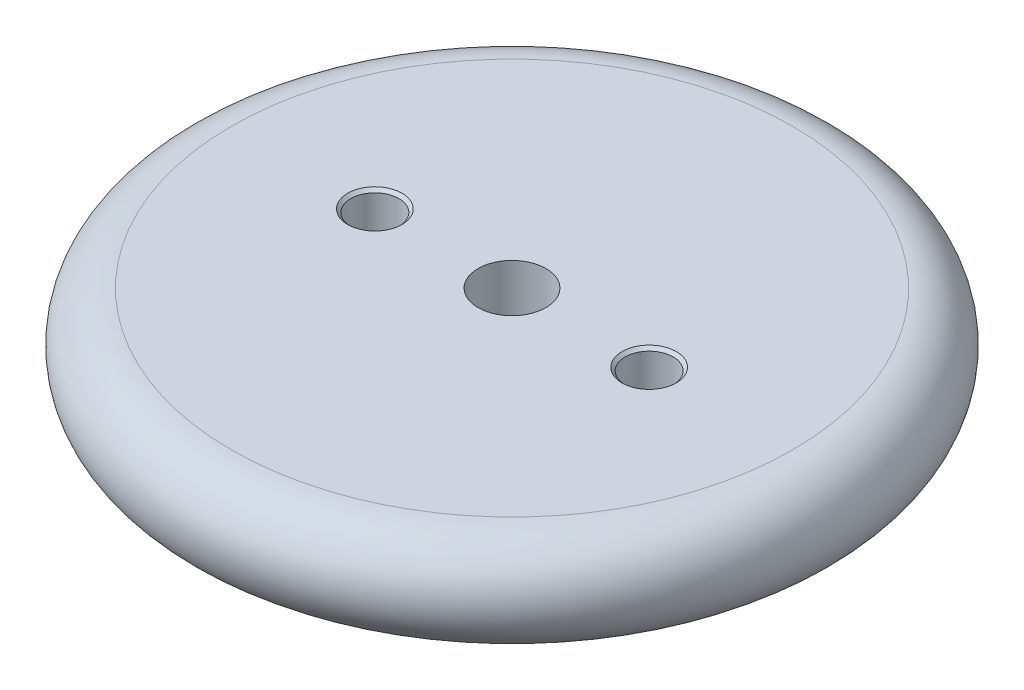
ISO-10303-21;
HEADER;
FILE_DESCRIPTION(('STEP AP214'),'2;1');
FILE_NAME('part.step','',(''),(''),'','','');
FILE_SCHEMA(('AUTOMOTIVE_DESIGN { 1 0 10303 214 1 1 1 1 }'));
ENDSEC;
DATA;
#1=APPLICATION_CONTEXT('core data for automotive mechanical design processes');
#2=APPLICATION_PROTOCOL_DEFINITION('international standard','automotive_design',2000,#1);
#3=PRODUCT_CONTEXT('',#1,'mechanical');
#4=PRODUCT('Part','Part','',(#3));
#5=PRODUCT_RELATED_PRODUCT_CATEGORY('part','',(#4));
#6=PRODUCT_DEFINITION_FORMATION('','',#4);
#7=PRODUCT_DEFINITION_CONTEXT('part definition',#1,'design');
#8=PRODUCT_DEFINITION('design','',#6,#7);
#9=PRODUCT_DEFINITION_SHAPE('','',#8);
#10=(LENGTH_UNIT() NAMED_UNIT(*) SI_UNIT(.MILLI.,.METRE.));
#11=(NAMED_UNIT(*) PLANE_ANGLE_UNIT() SI_UNIT($,.RADIAN.));
#12=(NAMED_UNIT(*) SI_UNIT($,.STERADIAN.) SOLID_ANGLE_UNIT());
#13=UNCERTAINTY_MEASURE_WITH_UNIT(LENGTH_MEASURE(1.E-05),#10,'distance_accuracy_value','');
#14=(GEOMETRIC_REPRESENTATION_CONTEXT(3) GLOBAL_UNCERTAINTY_ASSIGNED_CONTEXT((#13)) GLOBAL_UNIT_ASSIGNED_CONTEXT((#10,
#11,#12)) REPRESENTATION_CONTEXT('',''));
#15=CARTESIAN_POINT('',(0.,0.,0.));
#16=DIRECTION('',(0.,0.,1.));
#17=DIRECTION('',(1.,0.,0.));
#18=AXIS2_PLACEMENT_3D('',#15,#16,#17);
#19=CARTESIAN_POINT('',(-22.25,15.9999999999627,1.55257751099924E-13));
#20=DIRECTION('',(0.,1.,0.));
#21=DIRECTION('',(0.,0.,1.));
#22=AXIS2_PLACEMENT_3D('',#19,#20,#21);
#23=CONICAL_SURFACE('',#22,4.40499999996276,0.785398163397448);
#24=CARTESIAN_POINT('',(-22.25,16.0000000000197,1.55257751099924E-13));
#25=DIRECTION('',(0.,1.,0.));
#26=DIRECTION('',(0.,0.,1.));
#27=AXIS2_PLACEMENT_3D('',#24,#25,#26);
#28=CIRCLE('',#27,4.40500000001975);
#29=CARTESIAN_POINT('',(-22.25,16.0000000000197,4.40500000001991));
#30=VERTEX_POINT('',#29);
#31=EDGE_CURVE('E127',#30,#30,#28,.F.);
#32=ORIENTED_EDGE('',*,*,#31,.F.);
#33=EDGE_LOOP('',(#32));
#34=FACE_BOUND('',#33,.T.);
#35=CARTESIAN_POINT('',(-22.25,15.5,1.55370919578519E-13));
#36=DIRECTION('',(0.,1.,0.));
#37=DIRECTION('',(0.,0.,1.));
#38=AXIS2_PLACEMENT_3D('',#35,#36,#37);
#39=CIRCLE('',#38,3.905);
#40=CARTESIAN_POINT('',(-22.25,15.5,3.90500000000016));
#41=VERTEX_POINT('',#40);
#42=EDGE_CURVE('E117',#41,#41,#39,.F.);
#43=ORIENTED_EDGE('',*,*,#42,.T.);
#44=EDGE_LOOP('',(#43));
#45=FACE_BOUND('',#44,.T.);
#46=ADVANCED_FACE('F17',(#34,#45),#23,.F.);
#47=CARTESIAN_POINT('',(22.25,15.9999999999627,0.));
#48=DIRECTION('',(0.,1.,0.));
#49=DIRECTION('',(0.,0.,1.));
#50=AXIS2_PLACEMENT_3D('',#47,#48,#49);
#51=CONICAL_SURFACE('',#50,4.40499999996291,0.785398163397448);
#52=CARTESIAN_POINT('',(22.25,16.0000000000196,0.));
#53=DIRECTION('',(0.,1.,0.));
#54=DIRECTION('',(0.,0.,1.));
#55=AXIS2_PLACEMENT_3D('',#52,#53,#54);
#56=CIRCLE('',#55,4.40500000001975);
#57=CARTESIAN_POINT('',(22.25,16.0000000000196,4.40500000001975));
#58=VERTEX_POINT('',#57);
#59=EDGE_CURVE('E124',#58,#58,#56,.F.);
#60=ORIENTED_EDGE('',*,*,#59,.F.);
#61=EDGE_LOOP('',(#60));
#62=FACE_BOUND('',#61,.T.);
#63=CARTESIAN_POINT('',(22.25,15.5,0.));
#64=DIRECTION('',(0.,1.,0.));
#65=DIRECTION('',(0.,0.,1.));
#66=AXIS2_PLACEMENT_3D('',#63,#64,#65);
#67=CIRCLE('',#66,3.905);
#68=CARTESIAN_POINT('',(22.25,15.5,3.905));
#69=VERTEX_POINT('',#68);
#70=EDGE_CURVE('E50',#69,#69,#67,.F.);
#71=ORIENTED_EDGE('',*,*,#70,.T.);
#72=EDGE_LOOP('',(#71));
#73=FACE_BOUND('',#72,.T.);
#74=ADVANCED_FACE('F142',(#62,#73),#51,.F.);
#75=CARTESIAN_POINT('',(0.,16.,0.));
#76=DIRECTION('',(0.,1.,0.));
#77=DIRECTION('',(0.,0.,1.));
#78=AXIS2_PLACEMENT_3D('',#75,#76,#77);
#79=PLANE('',#78);
#80=CARTESIAN_POINT('',(0.,16.,0.));
#81=DIRECTION('',(0.,-1.,0.));
#82=DIRECTION('',(0.,0.,-1.));
#83=AXIS2_PLACEMENT_3D('',#80,#81,#82);
#84=CIRCLE('',#83,45.5);
#85=CARTESIAN_POINT('',(0.,16.,-45.5));
#86=VERTEX_POINT('',#85);
#87=CARTESIAN_POINT('',(0.,16.,45.5));
#88=VERTEX_POINT('',#87);
#89=EDGE_CURVE('E42',#86,#88,#84,.T.);
#90=ORIENTED_EDGE('',*,*,#89,.F.);
#91=CARTESIAN_POINT('',(0.,16.,0.));
#92=DIRECTION('',(0.,-1.,0.));
#93=DIRECTION('',(0.,0.,1.));
#94=AXIS2_PLACEMENT_3D('',#91,#92,#93);
#95=CIRCLE('',#94,45.5);
#96=EDGE_CURVE('E48',#88,#86,#95,.T.);
#97=ORIENTED_EDGE('',*,*,#96,.F.);
#98=EDGE_LOOP('',(#90,#97));
#99=FACE_BOUND('',#98,.T.);
#100=ORIENTED_EDGE('',*,*,#59,.T.);
#101=EDGE_LOOP('',(#100));
#102=FACE_BOUND('',#101,.T.);
#103=CARTESIAN_POINT('',(0.,16.,0.));
#104=DIRECTION('',(0.,1.,0.));
#105=DIRECTION('',(0.,0.,1.));
#106=AXIS2_PLACEMENT_3D('',#103,#104,#105);
#107=CIRCLE('',#106,5.5);
#108=CARTESIAN_POINT('',(0.,16.,5.5));
#109=VERTEX_POINT('',#108);
#110=EDGE_CURVE('E121',#109,#109,#107,.F.);
#111=ORIENTED_EDGE('',*,*,#110,.T.);
#112=EDGE_LOOP('',(#111));
#113=FACE_BOUND('',#112,.T.);
#114=ORIENTED_EDGE('',*,*,#31,.T.);
#115=EDGE_LOOP('',(#114));
#116=FACE_BOUND('',#115,.T.);
#117=ADVANCED_FACE('F46',(#99,#102,#113,#116),#79,.T.);
#118=CARTESIAN_POINT('',(-22.25,0.,1.55370919578519E-13));
#119=DIRECTION('',(0.,1.,0.));
#120=DIRECTION('',(0.,0.,1.));
#121=AXIS2_PLACEMENT_3D('',#118,#119,#120);
#122=CYLINDRICAL_SURFACE('',#121,3.905);
#123=ORIENTED_EDGE('',*,*,#42,.F.);
#124=EDGE_LOOP('',(#123));
#125=FACE_BOUND('',#124,.T.);
#126=CARTESIAN_POINT('',(-22.25,0.,1.55370919578519E-13));
#127=DIRECTION('',(0.,1.,0.));
#128=DIRECTION('',(0.,0.,1.));
#129=AXIS2_PLACEMENT_3D('',#126,#127,#128);
#130=CIRCLE('',#129,3.905);
#131=CARTESIAN_POINT('',(-22.25,0.,3.90500000000016));
#132=VERTEX_POINT('',#131);
#133=EDGE_CURVE('E55',#132,#132,#130,.T.);
#134=ORIENTED_EDGE('',*,*,#133,.F.);
#135=EDGE_LOOP('',(#134));
#136=FACE_BOUND('',#135,.T.);
#137=ADVANCED_FACE('F146',(#125,#136),#122,.F.);
#138=CARTESIAN_POINT('',(0.,0.,0.));
#139=DIRECTION('',(0.,1.,0.));
#140=DIRECTION('',(0.,0.,1.));
#141=AXIS2_PLACEMENT_3D('',#138,#139,#140);
#142=CYLINDRICAL_SURFACE('',#141,5.5);
#143=ORIENTED_EDGE('',*,*,#110,.F.);
#144=EDGE_LOOP('',(#143));
#145=FACE_BOUND('',#144,.T.);
#146=CARTESIAN_POINT('',(0.,0.,0.));
#147=DIRECTION('',(0.,1.,0.));
#148=DIRECTION('',(0.,0.,1.));
#149=AXIS2_PLACEMENT_3D('',#146,#147,#148);
#150=CIRCLE('',#149,5.5);
#151=CARTESIAN_POINT('',(0.,0.,5.5));
#152=VERTEX_POINT('',#151);
#153=EDGE_CURVE('E112',#152,#152,#150,.T.);
#154=ORIENTED_EDGE('',*,*,#153,.F.);
#155=EDGE_LOOP('',(#154));
#156=FACE_BOUND('',#155,.T.);
#157=ADVANCED_FACE('F149',(#145,#156),#142,.F.);
#158=CARTESIAN_POINT('',(22.25,0.,0.));
#159=DIRECTION('',(0.,1.,0.));
#160=DIRECTION('',(0.,0.,1.));
#161=AXIS2_PLACEMENT_3D('',#158,#159,#160);
#162=CYLINDRICAL_SURFACE('',#161,3.905);
#163=ORIENTED_EDGE('',*,*,#70,.F.);
#164=EDGE_LOOP('',(#163));
#165=FACE_BOUND('',#164,.T.);
#166=CARTESIAN_POINT('',(22.25,0.,0.));
#167=DIRECTION('',(0.,1.,0.));
#168=DIRECTION('',(0.,0.,1.));
#169=AXIS2_PLACEMENT_3D('',#166,#167,#168);
#170=CIRCLE('',#169,3.905);
#171=CARTESIAN_POINT('',(22.25,0.,3.905));
#172=VERTEX_POINT('',#171);
#173=EDGE_CURVE('E110',#172,#172,#170,.T.);
#174=ORIENTED_EDGE('',*,*,#173,.F.);
#175=EDGE_LOOP('',(#174));
#176=FACE_BOUND('',#175,.T.);
#177=ADVANCED_FACE('F76',(#165,#176),#162,.F.);
#178=CARTESIAN_POINT('',(0.,8.,0.));
#179=DIRECTION('',(0.,-1.,0.));
#180=DIRECTION('',(0.,0.,-1.));
#181=AXIS2_PLACEMENT_3D('',#178,#179,#180);
#182=TOROIDAL_SURFACE('',#181,45.5,8.);
#183=ORIENTED_EDGE('',*,*,#89,.T.);
#184=ORIENTED_EDGE('',*,*,#96,.T.);
#185=EDGE_LOOP('',(#183,#184));
#186=FACE_BOUND('',#185,.T.);
#187=CARTESIAN_POINT('',(0.,0.,0.));
#188=DIRECTION('',(0.,1.,0.));
#189=DIRECTION('',(0.,0.,-1.));
#190=AXIS2_PLACEMENT_3D('',#187,#188,#189);
#191=CIRCLE('',#190,45.5);
#192=CARTESIAN_POINT('',(0.,0.,45.5));
#193=VERTEX_POINT('',#192);
#194=CARTESIAN_POINT('',(0.,0.,-45.5));
#195=VERTEX_POINT('',#194);
#196=EDGE_CURVE('E11',#193,#195,#191,.F.);
#197=ORIENTED_EDGE('',*,*,#196,.F.);
#198=CARTESIAN_POINT('',(0.,0.,0.));
#199=DIRECTION('',(0.,1.,0.));
#200=DIRECTION('',(0.,0.,1.));
#201=AXIS2_PLACEMENT_3D('',#198,#199,#200);
#202=CIRCLE('',#201,45.5);
#203=EDGE_CURVE('E28',#195,#193,#202,.F.);
#204=ORIENTED_EDGE('',*,*,#203,.F.);
#205=EDGE_LOOP('',(#197,#204));
#206=FACE_BOUND('',#205,.T.);
#207=ADVANCED_FACE('F54',(#186,#206),#182,.T.);
#208=CARTESIAN_POINT('',(0.,0.,0.));
#209=DIRECTION('',(0.,-1.,0.));
#210=DIRECTION('',(0.,0.,-1.));
#211=AXIS2_PLACEMENT_3D('',#208,#209,#210);
#212=PLANE('',#211);
#213=ORIENTED_EDGE('',*,*,#203,.T.);
#214=ORIENTED_EDGE('',*,*,#196,.T.);
#215=EDGE_LOOP('',(#213,#214));
#216=FACE_BOUND('',#215,.T.);
#217=ORIENTED_EDGE('',*,*,#173,.T.);
#218=EDGE_LOOP('',(#217));
#219=FACE_BOUND('',#218,.T.);
#220=ORIENTED_EDGE('',*,*,#153,.T.);
#221=EDGE_LOOP('',(#220));
#222=FACE_BOUND('',#221,.T.);
#223=ORIENTED_EDGE('',*,*,#133,.T.);
#224=EDGE_LOOP('',(#223));
#225=FACE_BOUND('',#224,.T.);
#226=ADVANCED_FACE('F75',(#216,#219,#222,#225),#212,.T.);
#227=CLOSED_SHELL('',(#46,#74,#117,#137,#157,#177,#207,#226));
#228=MANIFOLD_SOLID_BREP('B1',#227);
#229=ADVANCED_BREP_SHAPE_REPRESENTATION('',(#18,#228),#14);
#230=SHAPE_DEFINITION_REPRESENTATION(#9,#229);
ENDSEC;
END-ISO-10303-21;
